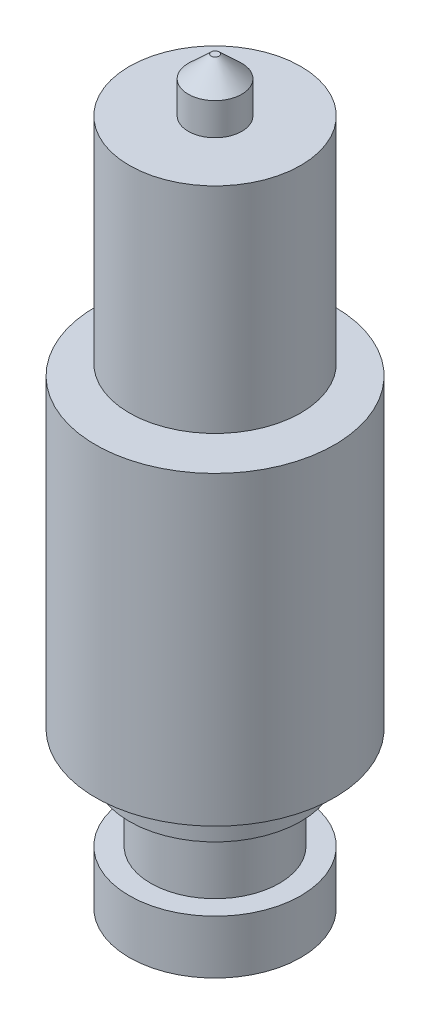
ISO-10303-21;
HEADER;
FILE_DESCRIPTION(('STEP AP214'),'2;1');
FILE_NAME('part.step','',(''),(''),'','','');
FILE_SCHEMA(('AUTOMOTIVE_DESIGN { 1 0 10303 214 1 1 1 1 }'));
ENDSEC;
DATA;
#1=APPLICATION_CONTEXT('core data for automotive mechanical design processes');
#2=APPLICATION_PROTOCOL_DEFINITION('international standard','automotive_design',2000,#1);
#3=PRODUCT_CONTEXT('',#1,'mechanical');
#4=PRODUCT('Part','Part','',(#3));
#5=PRODUCT_RELATED_PRODUCT_CATEGORY('part','',(#4));
#6=PRODUCT_DEFINITION_FORMATION('','',#4);
#7=PRODUCT_DEFINITION_CONTEXT('part definition',#1,'design');
#8=PRODUCT_DEFINITION('design','',#6,#7);
#9=PRODUCT_DEFINITION_SHAPE('','',#8);
#10=(LENGTH_UNIT() NAMED_UNIT(*) SI_UNIT(.MILLI.,.METRE.));
#11=(NAMED_UNIT(*) PLANE_ANGLE_UNIT() SI_UNIT($,.RADIAN.));
#12=(NAMED_UNIT(*) SI_UNIT($,.STERADIAN.) SOLID_ANGLE_UNIT());
#13=UNCERTAINTY_MEASURE_WITH_UNIT(LENGTH_MEASURE(1.E-05),#10,'distance_accuracy_value','');
#14=(GEOMETRIC_REPRESENTATION_CONTEXT(3) GLOBAL_UNCERTAINTY_ASSIGNED_CONTEXT((#13)) GLOBAL_UNIT_ASSIGNED_CONTEXT((#10,
#11,#12)) REPRESENTATION_CONTEXT('',''));
#15=CARTESIAN_POINT('',(0.,0.,0.));
#16=DIRECTION('',(0.,0.,1.));
#17=DIRECTION('',(1.,0.,0.));
#18=AXIS2_PLACEMENT_3D('',#15,#16,#17);
#19=CARTESIAN_POINT('',(0.,5.,0.));
#20=DIRECTION('',(0.,-1.,0.));
#21=DIRECTION('',(0.,0.,-1.));
#22=AXIS2_PLACEMENT_3D('',#19,#20,#21);
#23=CYLINDRICAL_SURFACE('',#22,8.);
#24=CARTESIAN_POINT('',(0.,5.,0.));
#25=DIRECTION('',(0.,1.,0.));
#26=DIRECTION('',(0.,0.,1.));
#27=AXIS2_PLACEMENT_3D('',#24,#25,#26);
#28=CIRCLE('',#27,8.);
#29=CARTESIAN_POINT('',(0.,5.,8.));
#30=VERTEX_POINT('',#29);
#31=EDGE_CURVE('E10',#30,#30,#28,.T.);
#32=ORIENTED_EDGE('',*,*,#31,.F.);
#33=EDGE_LOOP('',(#32));
#34=FACE_BOUND('',#33,.T.);
#35=CARTESIAN_POINT('',(0.,0.,0.));
#36=DIRECTION('',(0.,1.,0.));
#37=DIRECTION('',(0.,0.,1.));
#38=AXIS2_PLACEMENT_3D('',#35,#36,#37);
#39=CIRCLE('',#38,8.);
#40=CARTESIAN_POINT('',(0.,0.,8.));
#41=VERTEX_POINT('',#40);
#42=EDGE_CURVE('E42',#41,#41,#39,.T.);
#43=ORIENTED_EDGE('',*,*,#42,.T.);
#44=EDGE_LOOP('',(#43));
#45=FACE_BOUND('',#44,.T.);
#46=ADVANCED_FACE('F39',(#34,#45),#23,.T.);
#47=CARTESIAN_POINT('',(0.,5.,0.));
#48=DIRECTION('',(0.,1.,0.));
#49=DIRECTION('',(0.,0.,1.));
#50=AXIS2_PLACEMENT_3D('',#47,#48,#49);
#51=PLANE('',#50);
#52=CARTESIAN_POINT('',(0.,5.,0.));
#53=DIRECTION('',(0.,1.,0.));
#54=DIRECTION('',(0.,0.,1.));
#55=AXIS2_PLACEMENT_3D('',#52,#53,#54);
#56=CIRCLE('',#55,6.);
#57=CARTESIAN_POINT('',(0.,5.,6.));
#58=VERTEX_POINT('',#57);
#59=EDGE_CURVE('E51',#58,#58,#56,.T.);
#60=ORIENTED_EDGE('',*,*,#59,.F.);
#61=EDGE_LOOP('',(#60));
#62=FACE_BOUND('',#61,.T.);
#63=ORIENTED_EDGE('',*,*,#31,.T.);
#64=EDGE_LOOP('',(#63));
#65=FACE_BOUND('',#64,.T.);
#66=ADVANCED_FACE('F130',(#62,#65),#51,.T.);
#67=CARTESIAN_POINT('',(0.,0.,0.));
#68=DIRECTION('',(0.,1.,0.));
#69=DIRECTION('',(0.,0.,1.));
#70=AXIS2_PLACEMENT_3D('',#67,#68,#69);
#71=PLANE('',#70);
#72=ORIENTED_EDGE('',*,*,#42,.F.);
#73=EDGE_LOOP('',(#72));
#74=FACE_BOUND('',#73,.T.);
#75=ADVANCED_FACE('F135',(#74),#71,.F.);
#76=CARTESIAN_POINT('',(0.,11.,0.));
#77=DIRECTION('',(0.,-1.,0.));
#78=DIRECTION('',(0.,0.,-1.));
#79=AXIS2_PLACEMENT_3D('',#76,#77,#78);
#80=CYLINDRICAL_SURFACE('',#79,6.);
#81=CARTESIAN_POINT('',(0.,11.,0.));
#82=DIRECTION('',(0.,1.,0.));
#83=DIRECTION('',(0.,0.,1.));
#84=AXIS2_PLACEMENT_3D('',#81,#82,#83);
#85=CIRCLE('',#84,6.);
#86=CARTESIAN_POINT('',(0.,11.,6.));
#87=VERTEX_POINT('',#86);
#88=EDGE_CURVE('E49',#87,#87,#85,.T.);
#89=ORIENTED_EDGE('',*,*,#88,.F.);
#90=EDGE_LOOP('',(#89));
#91=FACE_BOUND('',#90,.T.);
#92=ORIENTED_EDGE('',*,*,#59,.T.);
#93=EDGE_LOOP('',(#92));
#94=FACE_BOUND('',#93,.T.);
#95=ADVANCED_FACE('F142',(#91,#94),#80,.T.);
#96=CARTESIAN_POINT('',(0.,12.5,0.));
#97=DIRECTION('',(0.,-1.,0.));
#98=DIRECTION('',(0.,0.,-1.));
#99=AXIS2_PLACEMENT_3D('',#96,#97,#98);
#100=CYLINDRICAL_SURFACE('',#99,8.);
#101=CARTESIAN_POINT('',(0.,12.5,0.));
#102=DIRECTION('',(0.,1.,0.));
#103=DIRECTION('',(0.,0.,1.));
#104=AXIS2_PLACEMENT_3D('',#101,#102,#103);
#105=CIRCLE('',#104,8.);
#106=CARTESIAN_POINT('',(0.,12.5,8.));
#107=VERTEX_POINT('',#106);
#108=EDGE_CURVE('E54',#107,#107,#105,.T.);
#109=ORIENTED_EDGE('',*,*,#108,.F.);
#110=EDGE_LOOP('',(#109));
#111=FACE_BOUND('',#110,.T.);
#112=CARTESIAN_POINT('',(0.,11.,0.));
#113=DIRECTION('',(0.,1.,0.));
#114=DIRECTION('',(0.,0.,1.));
#115=AXIS2_PLACEMENT_3D('',#112,#113,#114);
#116=CIRCLE('',#115,8.);
#117=CARTESIAN_POINT('',(0.,11.,8.));
#118=VERTEX_POINT('',#117);
#119=EDGE_CURVE('E57',#118,#118,#116,.T.);
#120=ORIENTED_EDGE('',*,*,#119,.T.);
#121=EDGE_LOOP('',(#120));
#122=FACE_BOUND('',#121,.T.);
#123=ADVANCED_FACE('F146',(#111,#122),#100,.T.);
#124=CARTESIAN_POINT('',(0.,12.5,0.));
#125=DIRECTION('',(0.,1.,0.));
#126=DIRECTION('',(0.,0.,1.));
#127=AXIS2_PLACEMENT_3D('',#124,#125,#126);
#128=PLANE('',#127);
#129=CARTESIAN_POINT('',(0.,12.5,0.));
#130=DIRECTION('',(0.,1.,0.));
#131=DIRECTION('',(0.,0.,1.));
#132=AXIS2_PLACEMENT_3D('',#129,#130,#131);
#133=CIRCLE('',#132,5.);
#134=CARTESIAN_POINT('',(0.,12.5,5.));
#135=VERTEX_POINT('',#134);
#136=EDGE_CURVE('E63',#135,#135,#133,.T.);
#137=ORIENTED_EDGE('',*,*,#136,.F.);
#138=EDGE_LOOP('',(#137));
#139=FACE_BOUND('',#138,.T.);
#140=ORIENTED_EDGE('',*,*,#108,.T.);
#141=EDGE_LOOP('',(#140));
#142=FACE_BOUND('',#141,.T.);
#143=ADVANCED_FACE('F152',(#139,#142),#128,.T.);
#144=CARTESIAN_POINT('',(0.,11.,0.));
#145=DIRECTION('',(0.,1.,0.));
#146=DIRECTION('',(0.,0.,1.));
#147=AXIS2_PLACEMENT_3D('',#144,#145,#146);
#148=PLANE('',#147);
#149=ORIENTED_EDGE('',*,*,#88,.T.);
#150=EDGE_LOOP('',(#149));
#151=FACE_BOUND('',#150,.T.);
#152=ORIENTED_EDGE('',*,*,#119,.F.);
#153=EDGE_LOOP('',(#152));
#154=FACE_BOUND('',#153,.T.);
#155=ADVANCED_FACE('F154',(#151,#154),#148,.F.);
#156=CARTESIAN_POINT('',(0.,14.5,0.));
#157=DIRECTION('',(0.,-1.,0.));
#158=DIRECTION('',(0.,0.,-1.));
#159=AXIS2_PLACEMENT_3D('',#156,#157,#158);
#160=CYLINDRICAL_SURFACE('',#159,5.);
#161=CARTESIAN_POINT('',(0.,14.5,0.));
#162=DIRECTION('',(0.,1.,0.));
#163=DIRECTION('',(0.,0.,1.));
#164=AXIS2_PLACEMENT_3D('',#161,#162,#163);
#165=CIRCLE('',#164,5.);
#166=CARTESIAN_POINT('',(0.,14.5,5.));
#167=VERTEX_POINT('',#166);
#168=EDGE_CURVE('E60',#167,#167,#165,.T.);
#169=ORIENTED_EDGE('',*,*,#168,.F.);
#170=EDGE_LOOP('',(#169));
#171=FACE_BOUND('',#170,.T.);
#172=ORIENTED_EDGE('',*,*,#136,.T.);
#173=EDGE_LOOP('',(#172));
#174=FACE_BOUND('',#173,.T.);
#175=ADVANCED_FACE('F157',(#171,#174),#160,.T.);
#176=CARTESIAN_POINT('',(0.,43.,0.));
#177=DIRECTION('',(0.,-1.,0.));
#178=DIRECTION('',(0.,0.,-1.));
#179=AXIS2_PLACEMENT_3D('',#176,#177,#178);
#180=CYLINDRICAL_SURFACE('',#179,11.15);
#181=CARTESIAN_POINT('',(0.,43.,0.));
#182=DIRECTION('',(0.,1.,0.));
#183=DIRECTION('',(0.,0.,1.));
#184=AXIS2_PLACEMENT_3D('',#181,#182,#183);
#185=CIRCLE('',#184,11.15);
#186=CARTESIAN_POINT('',(0.,43.,-11.15));
#187=VERTEX_POINT('',#186);
#188=EDGE_CURVE('E66',#187,#187,#185,.T.);
#189=CARTESIAN_POINT('',(0.,14.5,0.));
#190=DIRECTION('',(0.,1.,0.));
#191=DIRECTION('',(0.,0.,1.));
#192=AXIS2_PLACEMENT_3D('',#189,#190,#191);
#193=CIRCLE('',#192,11.15);
#194=CARTESIAN_POINT('',(0.,14.5,-11.15));
#195=VERTEX_POINT('',#194);
#196=EDGE_CURVE('E69',#195,#195,#193,.T.);
#197=CARTESIAN_POINT('',(0.,43.,-11.15));
#198=CARTESIAN_POINT('',(0.,42.703125,-11.15));
#199=CARTESIAN_POINT('',(0.,42.40625,-11.15));
#200=CARTESIAN_POINT('',(0.,41.8125,-11.15));
#201=CARTESIAN_POINT('',(0.,41.515625,-11.15));
#202=CARTESIAN_POINT('',(0.,40.921875,-11.15));
#203=CARTESIAN_POINT('',(0.,40.625,-11.15));
#204=CARTESIAN_POINT('',(0.,40.03125,-11.15));
#205=CARTESIAN_POINT('',(0.,39.734375,-11.15));
#206=CARTESIAN_POINT('',(0.,39.140625,-11.15));
#207=CARTESIAN_POINT('',(0.,38.84375,-11.15));
#208=CARTESIAN_POINT('',(0.,38.25,-11.15));
#209=CARTESIAN_POINT('',(0.,37.953125,-11.15));
#210=CARTESIAN_POINT('',(0.,37.359375,-11.15));
#211=CARTESIAN_POINT('',(0.,37.0625,-11.15));
#212=CARTESIAN_POINT('',(0.,36.46875,-11.15));
#213=CARTESIAN_POINT('',(0.,36.171875,-11.15));
#214=CARTESIAN_POINT('',(0.,35.578125,-11.15));
#215=CARTESIAN_POINT('',(0.,35.28125,-11.15));
#216=CARTESIAN_POINT('',(0.,34.6875,-11.15));
#217=CARTESIAN_POINT('',(0.,34.390625,-11.15));
#218=CARTESIAN_POINT('',(0.,33.796875,-11.15));
#219=CARTESIAN_POINT('',(0.,33.5,-11.15));
#220=CARTESIAN_POINT('',(0.,32.90625,-11.15));
#221=CARTESIAN_POINT('',(0.,32.609375,-11.15));
#222=CARTESIAN_POINT('',(0.,32.015625,-11.15));
#223=CARTESIAN_POINT('',(0.,31.71875,-11.15));
#224=CARTESIAN_POINT('',(0.,31.125,-11.15));
#225=CARTESIAN_POINT('',(0.,30.828125,-11.15));
#226=CARTESIAN_POINT('',(0.,30.234375,-11.15));
#227=CARTESIAN_POINT('',(0.,29.9375,-11.15));
#228=CARTESIAN_POINT('',(0.,29.34375,-11.15));
#229=CARTESIAN_POINT('',(0.,29.046875,-11.15));
#230=CARTESIAN_POINT('',(0.,28.453125,-11.15));
#231=CARTESIAN_POINT('',(0.,28.15625,-11.15));
#232=CARTESIAN_POINT('',(0.,27.5625,-11.15));
#233=CARTESIAN_POINT('',(0.,27.265625,-11.15));
#234=CARTESIAN_POINT('',(0.,26.671875,-11.15));
#235=CARTESIAN_POINT('',(0.,26.375,-11.15));
#236=CARTESIAN_POINT('',(0.,25.78125,-11.15));
#237=CARTESIAN_POINT('',(0.,25.484375,-11.15));
#238=CARTESIAN_POINT('',(0.,24.890625,-11.15));
#239=CARTESIAN_POINT('',(0.,24.59375,-11.15));
#240=CARTESIAN_POINT('',(0.,24.,-11.15));
#241=CARTESIAN_POINT('',(0.,23.703125,-11.15));
#242=CARTESIAN_POINT('',(0.,23.109375,-11.15));
#243=CARTESIAN_POINT('',(0.,22.8125,-11.15));
#244=CARTESIAN_POINT('',(0.,22.21875,-11.15));
#245=CARTESIAN_POINT('',(0.,21.921875,-11.15));
#246=CARTESIAN_POINT('',(0.,21.328125,-11.15));
#247=CARTESIAN_POINT('',(0.,21.03125,-11.15));
#248=CARTESIAN_POINT('',(0.,20.4375,-11.15));
#249=CARTESIAN_POINT('',(0.,20.140625,-11.15));
#250=CARTESIAN_POINT('',(0.,19.546875,-11.15));
#251=CARTESIAN_POINT('',(0.,19.25,-11.15));
#252=CARTESIAN_POINT('',(0.,18.65625,-11.15));
#253=CARTESIAN_POINT('',(0.,18.359375,-11.15));
#254=CARTESIAN_POINT('',(0.,17.765625,-11.15));
#255=CARTESIAN_POINT('',(0.,17.46875,-11.15));
#256=CARTESIAN_POINT('',(0.,16.875,-11.15));
#257=CARTESIAN_POINT('',(0.,16.578125,-11.15));
#258=CARTESIAN_POINT('',(0.,15.984375,-11.15));
#259=CARTESIAN_POINT('',(0.,15.6875,-11.15));
#260=CARTESIAN_POINT('',(0.,15.09375,-11.15));
#261=CARTESIAN_POINT('',(0.,14.796875,-11.15));
#262=CARTESIAN_POINT('',(0.,14.5,-11.15));
#263=B_SPLINE_CURVE_WITH_KNOTS('',3,(#197,#198,#199,#200,#201,#202,#203,#204,#205,#206,#207,
#208,#209,#210,#211,#212,#213,#214,#215,#216,#217,#218,#219,#220,#221,#222,#223,#224,#225,#226,
#227,#228,#229,#230,#231,#232,#233,#234,#235,#236,#237,#238,#239,#240,#241,#242,#243,#244,#245,
#246,#247,#248,#249,#250,#251,#252,#253,#254,#255,#256,#257,#258,#259,#260,#261,#262),
.UNSPECIFIED.,.F.,.F.,(4,2,2,2,2,2,2,2,2,2,2,2,2,2,2,2,2,2,2,2,2,2,2,2,2,2,2,2,2,2,2,2,4),(0.,
0.890625000000006,1.78125000000001,2.671875,3.5625,4.453125,5.34375,6.234375,7.12500000000001,
8.015625,8.90625,9.796875,10.6875,11.578125,12.46875,13.359375,14.25,15.140625,16.03125,
16.921875,17.8125,18.703125,19.59375,20.484375,21.375,22.265625,23.15625,24.046875,24.9375,
25.828125,26.71875,27.609375,28.5),.UNSPECIFIED.);
#264=EDGE_CURVE('BSEAM164',#187,#195,#263,.T.);
#265=ORIENTED_EDGE('',*,*,#188,.F.);
#266=ORIENTED_EDGE('',*,*,#196,.T.);
#267=ORIENTED_EDGE('',*,*,#264,.T.);
#268=ORIENTED_EDGE('',*,*,#264,.F.);
#269=EDGE_LOOP('',(#265,#267,#266,#268));
#270=FACE_BOUND('',#269,.T.);
#271=ADVANCED_FACE('F164',(#270),#180,.T.);
#272=CARTESIAN_POINT('',(0.,43.,0.));
#273=DIRECTION('',(0.,1.,0.));
#274=DIRECTION('',(0.,0.,1.));
#275=AXIS2_PLACEMENT_3D('',#272,#273,#274);
#276=PLANE('',#275);
#277=CARTESIAN_POINT('',(0.,43.,0.));
#278=DIRECTION('',(0.,1.,0.));
#279=DIRECTION('',(0.,0.,1.));
#280=AXIS2_PLACEMENT_3D('',#277,#278,#279);
#281=CIRCLE('',#280,2.);
#282=CARTESIAN_POINT('',(0.,43.,2.));
#283=VERTEX_POINT('',#282);
#284=EDGE_CURVE('E75',#283,#283,#281,.T.);
#285=ORIENTED_EDGE('',*,*,#284,.F.);
#286=EDGE_LOOP('',(#285));
#287=FACE_BOUND('',#286,.T.);
#288=ORIENTED_EDGE('',*,*,#188,.T.);
#289=EDGE_LOOP('',(#288));
#290=FACE_BOUND('',#289,.T.);
#291=ADVANCED_FACE('F168',(#287,#290),#276,.T.);
#292=CARTESIAN_POINT('',(0.,14.5,0.));
#293=DIRECTION('',(0.,1.,0.));
#294=DIRECTION('',(0.,0.,1.));
#295=AXIS2_PLACEMENT_3D('',#292,#293,#294);
#296=PLANE('',#295);
#297=ORIENTED_EDGE('',*,*,#168,.T.);
#298=EDGE_LOOP('',(#297));
#299=FACE_BOUND('',#298,.T.);
#300=ORIENTED_EDGE('',*,*,#196,.F.);
#301=EDGE_LOOP('',(#300));
#302=FACE_BOUND('',#301,.T.);
#303=ADVANCED_FACE('F170',(#299,#302),#296,.F.);
#304=CARTESIAN_POINT('',(0.,44.,0.));
#305=DIRECTION('',(0.,-1.,0.));
#306=DIRECTION('',(0.,0.,-1.));
#307=AXIS2_PLACEMENT_3D('',#304,#305,#306);
#308=CYLINDRICAL_SURFACE('',#307,2.);
#309=CARTESIAN_POINT('',(0.,44.,0.));
#310=DIRECTION('',(0.,1.,0.));
#311=DIRECTION('',(0.,0.,1.));
#312=AXIS2_PLACEMENT_3D('',#309,#310,#311);
#313=CIRCLE('',#312,2.);
#314=CARTESIAN_POINT('',(0.,44.,2.));
#315=VERTEX_POINT('',#314);
#316=EDGE_CURVE('E72',#315,#315,#313,.T.);
#317=ORIENTED_EDGE('',*,*,#316,.F.);
#318=EDGE_LOOP('',(#317));
#319=FACE_BOUND('',#318,.T.);
#320=ORIENTED_EDGE('',*,*,#284,.T.);
#321=EDGE_LOOP('',(#320));
#322=FACE_BOUND('',#321,.T.);
#323=ADVANCED_FACE('F120',(#319,#322),#308,.T.);
#324=CARTESIAN_POINT('',(0.,64.,0.));
#325=DIRECTION('',(0.,-1.,0.));
#326=DIRECTION('',(0.,0.,-1.));
#327=AXIS2_PLACEMENT_3D('',#324,#325,#326);
#328=CYLINDRICAL_SURFACE('',#327,8.);
#329=CARTESIAN_POINT('',(0.,64.,0.));
#330=DIRECTION('',(0.,1.,0.));
#331=DIRECTION('',(0.,0.,1.));
#332=AXIS2_PLACEMENT_3D('',#329,#330,#331);
#333=CIRCLE('',#332,8.);
#334=CARTESIAN_POINT('',(0.,64.,8.));
#335=VERTEX_POINT('',#334);
#336=EDGE_CURVE('E78',#335,#335,#333,.T.);
#337=ORIENTED_EDGE('',*,*,#336,.F.);
#338=EDGE_LOOP('',(#337));
#339=FACE_BOUND('',#338,.T.);
#340=CARTESIAN_POINT('',(0.,44.,0.));
#341=DIRECTION('',(0.,1.,0.));
#342=DIRECTION('',(0.,0.,1.));
#343=AXIS2_PLACEMENT_3D('',#340,#341,#342);
#344=CIRCLE('',#343,8.);
#345=CARTESIAN_POINT('',(0.,44.,8.));
#346=VERTEX_POINT('',#345);
#347=EDGE_CURVE('E81',#346,#346,#344,.T.);
#348=ORIENTED_EDGE('',*,*,#347,.T.);
#349=EDGE_LOOP('',(#348));
#350=FACE_BOUND('',#349,.T.);
#351=ADVANCED_FACE('F114',(#339,#350),#328,.T.);
#352=CARTESIAN_POINT('',(0.,64.,0.));
#353=DIRECTION('',(0.,1.,0.));
#354=DIRECTION('',(0.,0.,1.));
#355=AXIS2_PLACEMENT_3D('',#352,#353,#354);
#356=PLANE('',#355);
#357=CARTESIAN_POINT('',(0.,64.,0.));
#358=DIRECTION('',(0.,1.,0.));
#359=DIRECTION('',(0.,0.,1.));
#360=AXIS2_PLACEMENT_3D('',#357,#358,#359);
#361=CIRCLE('',#360,2.5);
#362=CARTESIAN_POINT('',(0.,64.,2.5));
#363=VERTEX_POINT('',#362);
#364=EDGE_CURVE('E87',#363,#363,#361,.T.);
#365=ORIENTED_EDGE('',*,*,#364,.F.);
#366=EDGE_LOOP('',(#365));
#367=FACE_BOUND('',#366,.T.);
#368=ORIENTED_EDGE('',*,*,#336,.T.);
#369=EDGE_LOOP('',(#368));
#370=FACE_BOUND('',#369,.T.);
#371=ADVANCED_FACE('F111',(#367,#370),#356,.T.);
#372=CARTESIAN_POINT('',(0.,44.,0.));
#373=DIRECTION('',(0.,1.,0.));
#374=DIRECTION('',(0.,0.,1.));
#375=AXIS2_PLACEMENT_3D('',#372,#373,#374);
#376=PLANE('',#375);
#377=ORIENTED_EDGE('',*,*,#316,.T.);
#378=EDGE_LOOP('',(#377));
#379=FACE_BOUND('',#378,.T.);
#380=ORIENTED_EDGE('',*,*,#347,.F.);
#381=EDGE_LOOP('',(#380));
#382=FACE_BOUND('',#381,.T.);
#383=ADVANCED_FACE('F107',(#379,#382),#376,.F.);
#384=CARTESIAN_POINT('',(0.,67.,0.));
#385=DIRECTION('',(0.,-1.,0.));
#386=DIRECTION('',(0.,0.,-1.));
#387=AXIS2_PLACEMENT_3D('',#384,#385,#386);
#388=CYLINDRICAL_SURFACE('',#387,2.5);
#389=CARTESIAN_POINT('',(0.,67.,0.));
#390=DIRECTION('',(0.,1.,0.));
#391=DIRECTION('',(0.,0.,1.));
#392=AXIS2_PLACEMENT_3D('',#389,#390,#391);
#393=CIRCLE('',#392,2.5);
#394=CARTESIAN_POINT('',(0.,67.,2.50000000000001));
#395=VERTEX_POINT('',#394);
#396=EDGE_CURVE('E84',#395,#395,#393,.T.);
#397=ORIENTED_EDGE('',*,*,#396,.F.);
#398=EDGE_LOOP('',(#397));
#399=FACE_BOUND('',#398,.T.);
#400=ORIENTED_EDGE('',*,*,#364,.T.);
#401=EDGE_LOOP('',(#400));
#402=FACE_BOUND('',#401,.T.);
#403=ADVANCED_FACE('F101',(#399,#402),#388,.T.);
#404=CARTESIAN_POINT('',(0.,67.,0.));
#405=DIRECTION('',(0.,-1.,0.));
#406=DIRECTION('',(0.,0.,1.));
#407=AXIS2_PLACEMENT_3D('',#404,#405,#406);
#408=CONICAL_SURFACE('',#407,2.5,0.820304748437336);
#409=CARTESIAN_POINT('',(0.,69.,0.));
#410=DIRECTION('',(0.,1.,0.));
#411=DIRECTION('',(0.,0.,1.));
#412=AXIS2_PLACEMENT_3D('',#409,#410,#411);
#413=CIRCLE('',#412,0.35526257995063);
#414=CARTESIAN_POINT('',(0.,69.,0.355262579950637));
#415=VERTEX_POINT('',#414);
#416=EDGE_CURVE('E90',#415,#415,#413,.T.);
#417=CARTESIAN_POINT('',(0.,69.,0.355262579950637));
#418=CARTESIAN_POINT('',(0.,68.9791666666667,0.377603594742819));
#419=CARTESIAN_POINT('',(0.,68.9583333333333,0.399944609534999));
#420=CARTESIAN_POINT('',(0.,68.9166666666667,0.44462663911936));
#421=CARTESIAN_POINT('',(0.,68.8958333333333,0.466967653911541));
#422=CARTESIAN_POINT('',(0.,68.8541666666667,0.511649683495903));
#423=CARTESIAN_POINT('',(0.,68.8333333333333,0.533990698288084));
#424=CARTESIAN_POINT('',(0.,68.7916666666667,0.578672727872447));
#425=CARTESIAN_POINT('',(0.,68.7708333333333,0.601013742664629));
#426=CARTESIAN_POINT('',(0.,68.7291666666667,0.645695772248991));
#427=CARTESIAN_POINT('',(0.,68.7083333333333,0.668036787041171));
#428=CARTESIAN_POINT('',(0.,68.6666666666667,0.712718816625532));
#429=CARTESIAN_POINT('',(0.,68.6458333333333,0.735059831417712));
#430=CARTESIAN_POINT('',(0.,68.6041666666667,0.779741861002074));
#431=CARTESIAN_POINT('',(0.,68.5833333333333,0.802082875794255));
#432=CARTESIAN_POINT('',(0.,68.5416666666667,0.846764905378618));
#433=CARTESIAN_POINT('',(0.,68.5208333333333,0.8691059201708));
#434=CARTESIAN_POINT('',(0.,68.4791666666667,0.913787949755162));
#435=CARTESIAN_POINT('',(0.,68.4583333333333,0.936128964547342));
#436=CARTESIAN_POINT('',(0.,68.4166666666667,0.980810994131703));
#437=CARTESIAN_POINT('',(0.,68.3958333333333,1.00315200892388));
#438=CARTESIAN_POINT('',(0.,68.3541666666667,1.04783403850825));
#439=CARTESIAN_POINT('',(0.,68.3333333333333,1.07017505330043));
#440=CARTESIAN_POINT('',(0.,68.2916666666667,1.11485708288479));
#441=CARTESIAN_POINT('',(0.,68.2708333333333,1.13719809767697));
#442=CARTESIAN_POINT('',(0.,68.2291666666667,1.18188012726133));
#443=CARTESIAN_POINT('',(0.,68.2083333333333,1.20422114205351));
#444=CARTESIAN_POINT('',(0.,68.1666666666667,1.24890317163787));
#445=CARTESIAN_POINT('',(0.,68.1458333333333,1.27124418643005));
#446=CARTESIAN_POINT('',(0.,68.1041666666667,1.31592621601442));
#447=CARTESIAN_POINT('',(0.,68.0833333333333,1.3382672308066));
#448=CARTESIAN_POINT('',(0.,68.0416666666667,1.38294926039096));
#449=CARTESIAN_POINT('',(0.,68.0208333333333,1.40529027518314));
#450=CARTESIAN_POINT('',(0.,67.9791666666667,1.4499723047675));
#451=CARTESIAN_POINT('',(0.,67.9583333333333,1.47231331955968));
#452=CARTESIAN_POINT('',(0.,67.9166666666667,1.51699534914405));
#453=CARTESIAN_POINT('',(0.,67.8958333333333,1.53933636393623));
#454=CARTESIAN_POINT('',(0.,67.8541666666667,1.58401839352059));
#455=CARTESIAN_POINT('',(0.,67.8333333333333,1.60635940831277));
#456=CARTESIAN_POINT('',(0.,67.7916666666667,1.65104143789713));
#457=CARTESIAN_POINT('',(0.,67.7708333333333,1.67338245268931));
#458=CARTESIAN_POINT('',(0.,67.7291666666667,1.71806448227368));
#459=CARTESIAN_POINT('',(0.,67.7083333333333,1.74040549706586));
#460=CARTESIAN_POINT('',(0.,67.6666666666667,1.78508752665022));
#461=CARTESIAN_POINT('',(0.,67.6458333333333,1.8074285414424));
#462=CARTESIAN_POINT('',(0.,67.6041666666667,1.85211057102676));
#463=CARTESIAN_POINT('',(0.,67.5833333333333,1.87445158581894));
#464=CARTESIAN_POINT('',(0.,67.5416666666667,1.9191336154033));
#465=CARTESIAN_POINT('',(0.,67.5208333333333,1.94147463019549));
#466=CARTESIAN_POINT('',(0.,67.4791666666667,1.98615665977985));
#467=CARTESIAN_POINT('',(0.,67.4583333333333,2.00849767457203));
#468=CARTESIAN_POINT('',(0.,67.4166666666667,2.05317970415639));
#469=CARTESIAN_POINT('',(0.,67.3958333333333,2.07552071894857));
#470=CARTESIAN_POINT('',(0.,67.3541666666667,2.12020274853293));
#471=CARTESIAN_POINT('',(0.,67.3333333333333,2.14254376332511));
#472=CARTESIAN_POINT('',(0.,67.2916666666667,2.18722579290947));
#473=CARTESIAN_POINT('',(0.,67.2708333333333,2.20956680770166));
#474=CARTESIAN_POINT('',(0.,67.2291666666667,2.25424883728602));
#475=CARTESIAN_POINT('',(0.,67.2083333333333,2.2765898520782));
#476=CARTESIAN_POINT('',(0.,67.1666666666667,2.32127188166256));
#477=CARTESIAN_POINT('',(0.,67.1458333333333,2.34361289645474));
#478=CARTESIAN_POINT('',(0.,67.1041666666667,2.3882949260391));
#479=CARTESIAN_POINT('',(0.,67.0833333333333,2.41063594083128));
#480=CARTESIAN_POINT('',(0.,67.0416666666667,2.45531797041565));
#481=CARTESIAN_POINT('',(0.,67.0208333333333,2.47765898520783));
#482=CARTESIAN_POINT('',(0.,67.,2.50000000000001));
#483=B_SPLINE_CURVE_WITH_KNOTS('',3,(#417,#418,#419,#420,#421,#422,#423,#424,#425,#426,#427,
#428,#429,#430,#431,#432,#433,#434,#435,#436,#437,#438,#439,#440,#441,#442,#443,#444,#445,#446,
#447,#448,#449,#450,#451,#452,#453,#454,#455,#456,#457,#458,#459,#460,#461,#462,#463,#464,#465,
#466,#467,#468,#469,#470,#471,#472,#473,#474,#475,#476,#477,#478,#479,#480,#481,#482),
.UNSPECIFIED.,.F.,.F.,(4,2,2,2,2,2,2,2,2,2,2,2,2,2,2,2,2,2,2,2,2,2,2,2,2,2,2,2,2,2,2,2,4),(0.,
0.0916424491024813,0.183284898204963,0.274927347307435,0.366569796409907,0.458212245512388,
0.54985469461487,0.641497143717342,0.733139592819814,0.824782041922295,0.916424491024777,
1.00806694012725,1.09970938922972,1.1913518383322,1.28299428743468,1.37463673653716,
1.46627918563963,1.55792163474211,1.64956408384459,1.74120653294706,1.83284898204953,
1.92449143115202,2.0161338802545,2.10777632935697,2.19941877845944,2.29106122756192,
2.3827036766644,2.47434612576688,2.56598857486935,2.65763102397183,2.74927347307431,
2.84091592217678,2.93255837127925),.UNSPECIFIED.);
#484=EDGE_CURVE('BSEAM98',#415,#395,#483,.T.);
#485=ORIENTED_EDGE('',*,*,#416,.F.);
#486=ORIENTED_EDGE('',*,*,#396,.T.);
#487=ORIENTED_EDGE('',*,*,#484,.T.);
#488=ORIENTED_EDGE('',*,*,#484,.F.);
#489=EDGE_LOOP('',(#485,#487,#486,#488));
#490=FACE_BOUND('',#489,.T.);
#491=ADVANCED_FACE('F98',(#490),#408,.T.);
#492=CARTESIAN_POINT('',(0.,69.,0.));
#493=DIRECTION('',(0.,1.,0.));
#494=DIRECTION('',(0.,0.,1.));
#495=AXIS2_PLACEMENT_3D('',#492,#493,#494);
#496=PLANE('',#495);
#497=ORIENTED_EDGE('',*,*,#416,.T.);
#498=EDGE_LOOP('',(#497));
#499=FACE_BOUND('',#498,.T.);
#500=ADVANCED_FACE('F96',(#499),#496,.T.);
#501=CLOSED_SHELL('',(#46,#66,#75,#95,#123,#143,#155,#175,#271,#291,#303,#323,#351,#371,#383,
#403,#491,#500));
#502=MANIFOLD_SOLID_BREP('B2',#501);
#503=ADVANCED_BREP_SHAPE_REPRESENTATION('',(#18,#502),#14);
#504=SHAPE_DEFINITION_REPRESENTATION(#9,#503);
ENDSEC;
END-ISO-10303-21;
